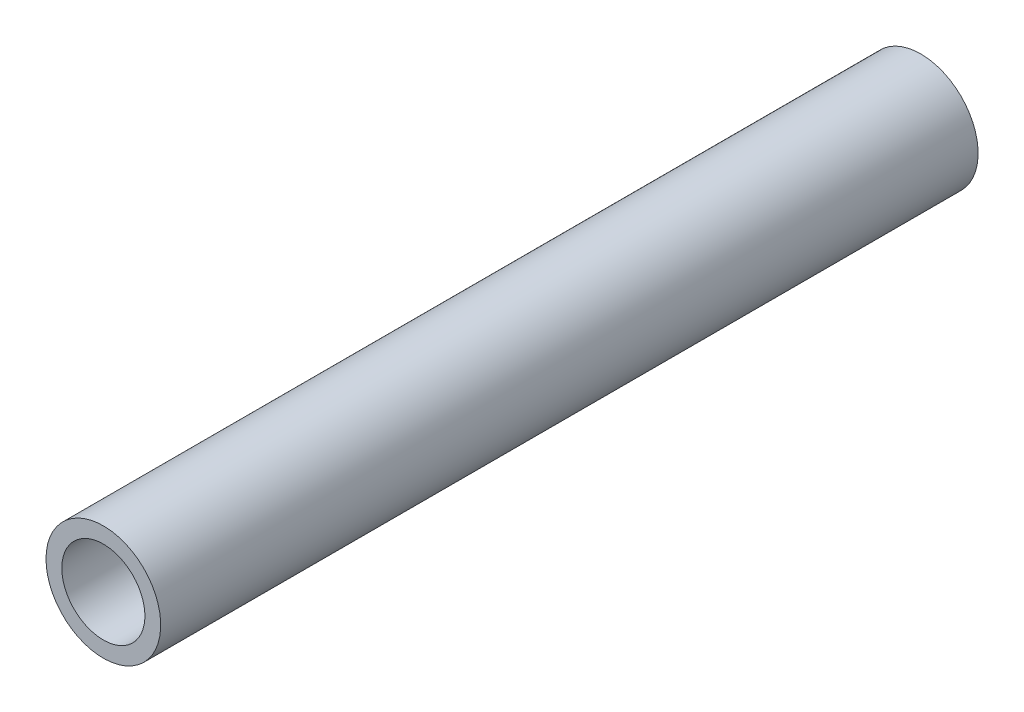
ISO-10303-21;
HEADER;
FILE_DESCRIPTION(('STEP AP214'),'2;1');
FILE_NAME('part.step','',(''),(''),'','','');
FILE_SCHEMA(('AUTOMOTIVE_DESIGN { 1 0 10303 214 1 1 1 1 }'));
ENDSEC;
DATA;
#1=APPLICATION_CONTEXT('core data for automotive mechanical design processes');
#2=APPLICATION_PROTOCOL_DEFINITION('international standard','automotive_design',2000,#1);
#3=PRODUCT_CONTEXT('',#1,'mechanical');
#4=PRODUCT('Part','Part','',(#3));
#5=PRODUCT_RELATED_PRODUCT_CATEGORY('part','',(#4));
#6=PRODUCT_DEFINITION_FORMATION('','',#4);
#7=PRODUCT_DEFINITION_CONTEXT('part definition',#1,'design');
#8=PRODUCT_DEFINITION('design','',#6,#7);
#9=PRODUCT_DEFINITION_SHAPE('','',#8);
#10=(LENGTH_UNIT() NAMED_UNIT(*) SI_UNIT(.MILLI.,.METRE.));
#11=(NAMED_UNIT(*) PLANE_ANGLE_UNIT() SI_UNIT($,.RADIAN.));
#12=(NAMED_UNIT(*) SI_UNIT($,.STERADIAN.) SOLID_ANGLE_UNIT());
#13=UNCERTAINTY_MEASURE_WITH_UNIT(LENGTH_MEASURE(1.E-05),#10,'distance_accuracy_value','');
#14=(GEOMETRIC_REPRESENTATION_CONTEXT(3) GLOBAL_UNCERTAINTY_ASSIGNED_CONTEXT((#13)) GLOBAL_UNIT_ASSIGNED_CONTEXT((#10,
#11,#12)) REPRESENTATION_CONTEXT('',''));
#15=CARTESIAN_POINT('',(0.,0.,0.));
#16=DIRECTION('',(0.,0.,1.));
#17=DIRECTION('',(1.,0.,0.));
#18=AXIS2_PLACEMENT_3D('',#15,#16,#17);
#19=CARTESIAN_POINT('',(0.,0.,152.4));
#20=DIRECTION('',(0.,0.,1.));
#21=DIRECTION('',(1.,0.,0.));
#22=AXIS2_PLACEMENT_3D('',#19,#20,#21);
#23=PLANE('',#22);
#24=CARTESIAN_POINT('',(0.,0.,152.4));
#25=DIRECTION('',(0.,0.,1.));
#26=DIRECTION('',(1.,0.,0.));
#27=AXIS2_PLACEMENT_3D('',#24,#25,#26);
#28=CIRCLE('',#27,10.6934);
#29=CARTESIAN_POINT('',(-10.6934,0.,152.4));
#30=VERTEX_POINT('',#29);
#31=EDGE_CURVE('E10',#30,#30,#28,.T.);
#32=ORIENTED_EDGE('',*,*,#31,.T.);
#33=EDGE_LOOP('',(#32));
#34=FACE_BOUND('',#33,.T.);
#35=CARTESIAN_POINT('',(0.,0.,152.4));
#36=DIRECTION('',(0.,0.,1.));
#37=DIRECTION('',(1.,0.,0.));
#38=AXIS2_PLACEMENT_3D('',#35,#36,#37);
#39=CIRCLE('',#38,7.747);
#40=CARTESIAN_POINT('',(-7.747,0.,152.4));
#41=VERTEX_POINT('',#40);
#42=EDGE_CURVE('E41',#41,#41,#39,.T.);
#43=ORIENTED_EDGE('',*,*,#42,.F.);
#44=EDGE_LOOP('',(#43));
#45=FACE_BOUND('',#44,.T.);
#46=ADVANCED_FACE('F30',(#34,#45),#23,.T.);
#47=CARTESIAN_POINT('',(0.,0.,0.));
#48=DIRECTION('',(0.,0.,1.));
#49=DIRECTION('',(1.,0.,0.));
#50=AXIS2_PLACEMENT_3D('',#47,#48,#49);
#51=PLANE('',#50);
#52=CARTESIAN_POINT('',(0.,0.,0.));
#53=DIRECTION('',(0.,0.,1.));
#54=DIRECTION('',(1.,0.,0.));
#55=AXIS2_PLACEMENT_3D('',#52,#53,#54);
#56=CIRCLE('',#55,10.6934);
#57=CARTESIAN_POINT('',(-10.6934,0.,0.));
#58=VERTEX_POINT('',#57);
#59=EDGE_CURVE('E34',#58,#58,#56,.T.);
#60=ORIENTED_EDGE('',*,*,#59,.F.);
#61=EDGE_LOOP('',(#60));
#62=FACE_BOUND('',#61,.T.);
#63=CARTESIAN_POINT('',(0.,0.,0.));
#64=DIRECTION('',(0.,0.,1.));
#65=DIRECTION('',(1.,0.,0.));
#66=AXIS2_PLACEMENT_3D('',#63,#64,#65);
#67=CIRCLE('',#66,7.747);
#68=CARTESIAN_POINT('',(-7.747,0.,0.));
#69=VERTEX_POINT('',#68);
#70=EDGE_CURVE('E43',#69,#69,#67,.T.);
#71=ORIENTED_EDGE('',*,*,#70,.T.);
#72=EDGE_LOOP('',(#71));
#73=FACE_BOUND('',#72,.T.);
#74=ADVANCED_FACE('F53',(#62,#73),#51,.F.);
#75=CARTESIAN_POINT('',(0.,0.,152.4));
#76=DIRECTION('',(0.,0.,-1.));
#77=DIRECTION('',(-1.,0.,0.));
#78=AXIS2_PLACEMENT_3D('',#75,#76,#77);
#79=CYLINDRICAL_SURFACE('',#78,10.6934);
#80=CARTESIAN_POINT('',(-10.6934,0.,152.4));
#81=CARTESIAN_POINT('',(-10.6934,0.,150.8125));
#82=CARTESIAN_POINT('',(-10.6934,0.,149.225));
#83=CARTESIAN_POINT('',(-10.6934,0.,146.05));
#84=CARTESIAN_POINT('',(-10.6934,0.,144.4625));
#85=CARTESIAN_POINT('',(-10.6934,0.,141.2875));
#86=CARTESIAN_POINT('',(-10.6934,0.,139.7));
#87=CARTESIAN_POINT('',(-10.6934,0.,136.525));
#88=CARTESIAN_POINT('',(-10.6934,0.,134.9375));
#89=CARTESIAN_POINT('',(-10.6934,0.,131.7625));
#90=CARTESIAN_POINT('',(-10.6934,0.,130.175));
#91=CARTESIAN_POINT('',(-10.6934,0.,127.));
#92=CARTESIAN_POINT('',(-10.6934,0.,125.4125));
#93=CARTESIAN_POINT('',(-10.6934,0.,122.2375));
#94=CARTESIAN_POINT('',(-10.6934,0.,120.65));
#95=CARTESIAN_POINT('',(-10.6934,0.,117.475));
#96=CARTESIAN_POINT('',(-10.6934,0.,115.8875));
#97=CARTESIAN_POINT('',(-10.6934,0.,112.7125));
#98=CARTESIAN_POINT('',(-10.6934,0.,111.125));
#99=CARTESIAN_POINT('',(-10.6934,0.,107.95));
#100=CARTESIAN_POINT('',(-10.6934,0.,106.3625));
#101=CARTESIAN_POINT('',(-10.6934,0.,103.1875));
#102=CARTESIAN_POINT('',(-10.6934,0.,101.6));
#103=CARTESIAN_POINT('',(-10.6934,0.,98.425));
#104=CARTESIAN_POINT('',(-10.6934,0.,96.8375));
#105=CARTESIAN_POINT('',(-10.6934,0.,93.6625));
#106=CARTESIAN_POINT('',(-10.6934,0.,92.075));
#107=CARTESIAN_POINT('',(-10.6934,0.,88.9));
#108=CARTESIAN_POINT('',(-10.6934,0.,87.3125));
#109=CARTESIAN_POINT('',(-10.6934,0.,84.1375));
#110=CARTESIAN_POINT('',(-10.6934,0.,82.55));
#111=CARTESIAN_POINT('',(-10.6934,0.,79.375));
#112=CARTESIAN_POINT('',(-10.6934,0.,77.7875));
#113=CARTESIAN_POINT('',(-10.6934,0.,74.6125));
#114=CARTESIAN_POINT('',(-10.6934,0.,73.025));
#115=CARTESIAN_POINT('',(-10.6934,0.,69.85));
#116=CARTESIAN_POINT('',(-10.6934,0.,68.2625));
#117=CARTESIAN_POINT('',(-10.6934,0.,65.0875));
#118=CARTESIAN_POINT('',(-10.6934,0.,63.5));
#119=CARTESIAN_POINT('',(-10.6934,0.,60.325));
#120=CARTESIAN_POINT('',(-10.6934,0.,58.7375));
#121=CARTESIAN_POINT('',(-10.6934,0.,55.5625));
#122=CARTESIAN_POINT('',(-10.6934,0.,53.975));
#123=CARTESIAN_POINT('',(-10.6934,0.,50.8));
#124=CARTESIAN_POINT('',(-10.6934,0.,49.2125));
#125=CARTESIAN_POINT('',(-10.6934,0.,46.0375));
#126=CARTESIAN_POINT('',(-10.6934,0.,44.45));
#127=CARTESIAN_POINT('',(-10.6934,0.,41.275));
#128=CARTESIAN_POINT('',(-10.6934,0.,39.6875));
#129=CARTESIAN_POINT('',(-10.6934,0.,36.5125));
#130=CARTESIAN_POINT('',(-10.6934,0.,34.925));
#131=CARTESIAN_POINT('',(-10.6934,0.,31.75));
#132=CARTESIAN_POINT('',(-10.6934,0.,30.1625));
#133=CARTESIAN_POINT('',(-10.6934,0.,26.9875));
#134=CARTESIAN_POINT('',(-10.6934,0.,25.4));
#135=CARTESIAN_POINT('',(-10.6934,0.,22.225));
#136=CARTESIAN_POINT('',(-10.6934,0.,20.6375));
#137=CARTESIAN_POINT('',(-10.6934,0.,17.4625));
#138=CARTESIAN_POINT('',(-10.6934,0.,15.875));
#139=CARTESIAN_POINT('',(-10.6934,0.,12.7));
#140=CARTESIAN_POINT('',(-10.6934,0.,11.1125));
#141=CARTESIAN_POINT('',(-10.6934,0.,7.93750000000001));
#142=CARTESIAN_POINT('',(-10.6934,0.,6.35));
#143=CARTESIAN_POINT('',(-10.6934,0.,3.175));
#144=CARTESIAN_POINT('',(-10.6934,0.,1.5875));
#145=CARTESIAN_POINT('',(-10.6934,0.,0.));
#146=B_SPLINE_CURVE_WITH_KNOTS('',3,(#80,#81,#82,#83,#84,#85,#86,#87,#88,#89,#90,#91,#92,#93,
#94,#95,#96,#97,#98,#99,#100,#101,#102,#103,#104,#105,#106,#107,#108,#109,#110,#111,#112,#113,
#114,#115,#116,#117,#118,#119,#120,#121,#122,#123,#124,#125,#126,#127,#128,#129,#130,#131,#132,
#133,#134,#135,#136,#137,#138,#139,#140,#141,#142,#143,#144,#145),.UNSPECIFIED.,.F.,.F.,(4,2,2,
2,2,2,2,2,2,2,2,2,2,2,2,2,2,2,2,2,2,2,2,2,2,2,2,2,2,2,2,2,4),(0.,4.76249999999998,
9.52499999999998,14.2875,19.05,23.8125,28.575,33.3375,38.1,42.8625,47.625,52.3875,57.15,61.9125,
66.675,71.4375,76.2,80.9625,85.725,90.4875,95.25,100.0125,104.775,109.5375,114.3,119.0625,
123.825,128.5875,133.35,138.1125,142.875,147.6375,152.4),.UNSPECIFIED.);
#147=EDGE_CURVE('BSEAM32',#30,#58,#146,.T.);
#148=ORIENTED_EDGE('',*,*,#31,.F.);
#149=ORIENTED_EDGE('',*,*,#59,.T.);
#150=ORIENTED_EDGE('',*,*,#147,.T.);
#151=ORIENTED_EDGE('',*,*,#147,.F.);
#152=EDGE_LOOP('',(#148,#150,#149,#151));
#153=FACE_BOUND('',#152,.T.);
#154=ADVANCED_FACE('F32',(#153),#79,.T.);
#155=CARTESIAN_POINT('',(0.,0.,152.4));
#156=DIRECTION('',(0.,0.,-1.));
#157=DIRECTION('',(-1.,0.,0.));
#158=AXIS2_PLACEMENT_3D('',#155,#156,#157);
#159=CYLINDRICAL_SURFACE('',#158,7.747);
#160=CARTESIAN_POINT('',(-7.747,0.,152.4));
#161=CARTESIAN_POINT('',(-7.747,0.,150.8125));
#162=CARTESIAN_POINT('',(-7.747,0.,149.225));
#163=CARTESIAN_POINT('',(-7.747,0.,146.05));
#164=CARTESIAN_POINT('',(-7.747,0.,144.4625));
#165=CARTESIAN_POINT('',(-7.747,0.,141.2875));
#166=CARTESIAN_POINT('',(-7.747,0.,139.7));
#167=CARTESIAN_POINT('',(-7.747,0.,136.525));
#168=CARTESIAN_POINT('',(-7.747,0.,134.9375));
#169=CARTESIAN_POINT('',(-7.747,0.,131.7625));
#170=CARTESIAN_POINT('',(-7.747,0.,130.175));
#171=CARTESIAN_POINT('',(-7.747,0.,127.));
#172=CARTESIAN_POINT('',(-7.747,0.,125.4125));
#173=CARTESIAN_POINT('',(-7.747,0.,122.2375));
#174=CARTESIAN_POINT('',(-7.747,0.,120.65));
#175=CARTESIAN_POINT('',(-7.747,0.,117.475));
#176=CARTESIAN_POINT('',(-7.747,0.,115.8875));
#177=CARTESIAN_POINT('',(-7.747,0.,112.7125));
#178=CARTESIAN_POINT('',(-7.747,0.,111.125));
#179=CARTESIAN_POINT('',(-7.747,0.,107.95));
#180=CARTESIAN_POINT('',(-7.747,0.,106.3625));
#181=CARTESIAN_POINT('',(-7.747,0.,103.1875));
#182=CARTESIAN_POINT('',(-7.747,0.,101.6));
#183=CARTESIAN_POINT('',(-7.747,0.,98.425));
#184=CARTESIAN_POINT('',(-7.747,0.,96.8375));
#185=CARTESIAN_POINT('',(-7.747,0.,93.6625));
#186=CARTESIAN_POINT('',(-7.747,0.,92.075));
#187=CARTESIAN_POINT('',(-7.747,0.,88.9));
#188=CARTESIAN_POINT('',(-7.747,0.,87.3125));
#189=CARTESIAN_POINT('',(-7.747,0.,84.1375));
#190=CARTESIAN_POINT('',(-7.747,0.,82.55));
#191=CARTESIAN_POINT('',(-7.747,0.,79.375));
#192=CARTESIAN_POINT('',(-7.747,0.,77.7875));
#193=CARTESIAN_POINT('',(-7.747,0.,74.6125));
#194=CARTESIAN_POINT('',(-7.747,0.,73.025));
#195=CARTESIAN_POINT('',(-7.747,0.,69.85));
#196=CARTESIAN_POINT('',(-7.747,0.,68.2625));
#197=CARTESIAN_POINT('',(-7.747,0.,65.0875));
#198=CARTESIAN_POINT('',(-7.747,0.,63.5));
#199=CARTESIAN_POINT('',(-7.747,0.,60.325));
#200=CARTESIAN_POINT('',(-7.747,0.,58.7375));
#201=CARTESIAN_POINT('',(-7.747,0.,55.5625));
#202=CARTESIAN_POINT('',(-7.747,0.,53.975));
#203=CARTESIAN_POINT('',(-7.747,0.,50.8));
#204=CARTESIAN_POINT('',(-7.747,0.,49.2125));
#205=CARTESIAN_POINT('',(-7.747,0.,46.0375));
#206=CARTESIAN_POINT('',(-7.747,0.,44.45));
#207=CARTESIAN_POINT('',(-7.747,0.,41.275));
#208=CARTESIAN_POINT('',(-7.747,0.,39.6875));
#209=CARTESIAN_POINT('',(-7.747,0.,36.5125));
#210=CARTESIAN_POINT('',(-7.747,0.,34.925));
#211=CARTESIAN_POINT('',(-7.747,0.,31.75));
#212=CARTESIAN_POINT('',(-7.747,0.,30.1625));
#213=CARTESIAN_POINT('',(-7.747,0.,26.9875));
#214=CARTESIAN_POINT('',(-7.747,0.,25.4));
#215=CARTESIAN_POINT('',(-7.747,0.,22.225));
#216=CARTESIAN_POINT('',(-7.747,0.,20.6375));
#217=CARTESIAN_POINT('',(-7.747,0.,17.4625));
#218=CARTESIAN_POINT('',(-7.747,0.,15.875));
#219=CARTESIAN_POINT('',(-7.747,0.,12.7));
#220=CARTESIAN_POINT('',(-7.747,0.,11.1125));
#221=CARTESIAN_POINT('',(-7.747,0.,7.93750000000001));
#222=CARTESIAN_POINT('',(-7.747,0.,6.35));
#223=CARTESIAN_POINT('',(-7.747,0.,3.175));
#224=CARTESIAN_POINT('',(-7.747,0.,1.5875));
#225=CARTESIAN_POINT('',(-7.747,0.,0.));
#226=B_SPLINE_CURVE_WITH_KNOTS('',3,(#160,#161,#162,#163,#164,#165,#166,#167,#168,#169,#170,
#171,#172,#173,#174,#175,#176,#177,#178,#179,#180,#181,#182,#183,#184,#185,#186,#187,#188,#189,
#190,#191,#192,#193,#194,#195,#196,#197,#198,#199,#200,#201,#202,#203,#204,#205,#206,#207,#208,
#209,#210,#211,#212,#213,#214,#215,#216,#217,#218,#219,#220,#221,#222,#223,#224,#225),
.UNSPECIFIED.,.F.,.F.,(4,2,2,2,2,2,2,2,2,2,2,2,2,2,2,2,2,2,2,2,2,2,2,2,2,2,2,2,2,2,2,2,4),(0.,
4.7625,9.52500000000001,14.2875,19.05,23.8125,28.575,33.3375,38.1,42.8625,47.625,52.3875,57.15,
61.9125,66.675,71.4375,76.2,80.9625,85.725,90.4875,95.25,100.0125,104.775,109.5375,114.3,
119.0625,123.825,128.5875,133.35,138.1125,142.875,147.6375,152.4),.UNSPECIFIED.);
#227=EDGE_CURVE('BSEAM49',#41,#69,#226,.T.);
#228=ORIENTED_EDGE('',*,*,#42,.T.);
#229=ORIENTED_EDGE('',*,*,#70,.F.);
#230=ORIENTED_EDGE('',*,*,#227,.T.);
#231=ORIENTED_EDGE('',*,*,#227,.F.);
#232=EDGE_LOOP('',(#228,#230,#229,#231));
#233=FACE_BOUND('',#232,.T.);
#234=ADVANCED_FACE('F49',(#233),#159,.F.);
#235=CLOSED_SHELL('',(#46,#74,#154,#234));
#236=MANIFOLD_SOLID_BREP('B2',#235);
#237=ADVANCED_BREP_SHAPE_REPRESENTATION('',(#18,#236),#14);
#238=SHAPE_DEFINITION_REPRESENTATION(#9,#237);
ENDSEC;
END-ISO-10303-21;
